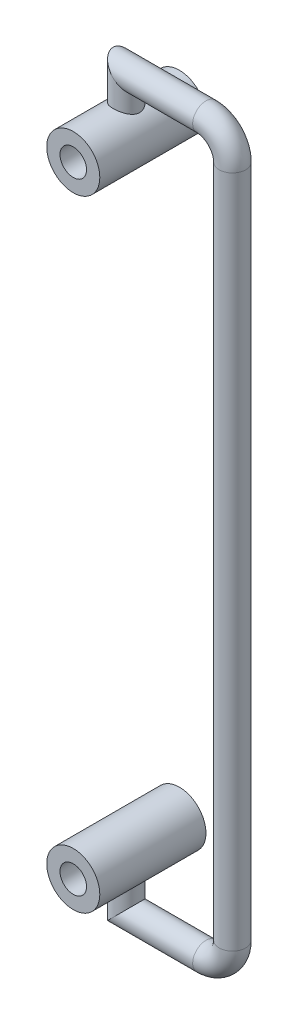
ISO-10303-21;
HEADER;
FILE_DESCRIPTION(('STEP AP214'),'2;1');
FILE_NAME('part.step','',(''),(''),'','','');
FILE_SCHEMA(('AUTOMOTIVE_DESIGN { 1 0 10303 214 1 1 1 1 }'));
ENDSEC;
DATA;
#1=APPLICATION_CONTEXT('core data for automotive mechanical design processes');
#2=APPLICATION_PROTOCOL_DEFINITION('international standard','automotive_design',2000,#1);
#3=PRODUCT_CONTEXT('',#1,'mechanical');
#4=PRODUCT('Part','Part','',(#3));
#5=PRODUCT_RELATED_PRODUCT_CATEGORY('part','',(#4));
#6=PRODUCT_DEFINITION_FORMATION('','',#4);
#7=PRODUCT_DEFINITION_CONTEXT('part definition',#1,'design');
#8=PRODUCT_DEFINITION('design','',#6,#7);
#9=PRODUCT_DEFINITION_SHAPE('','',#8);
#10=(LENGTH_UNIT() NAMED_UNIT(*) SI_UNIT(.MILLI.,.METRE.));
#11=(NAMED_UNIT(*) PLANE_ANGLE_UNIT() SI_UNIT($,.RADIAN.));
#12=(NAMED_UNIT(*) SI_UNIT($,.STERADIAN.) SOLID_ANGLE_UNIT());
#13=UNCERTAINTY_MEASURE_WITH_UNIT(LENGTH_MEASURE(1.E-05),#10,'distance_accuracy_value','');
#14=(GEOMETRIC_REPRESENTATION_CONTEXT(3) GLOBAL_UNCERTAINTY_ASSIGNED_CONTEXT((#13)) GLOBAL_UNIT_ASSIGNED_CONTEXT((#10,
#11,#12)) REPRESENTATION_CONTEXT('',''));
#15=CARTESIAN_POINT('',(0.,0.,0.));
#16=DIRECTION('',(0.,0.,1.));
#17=DIRECTION('',(1.,0.,0.));
#18=AXIS2_PLACEMENT_3D('',#15,#16,#17);
#19=CARTESIAN_POINT('',(0.,0.,0.));
#20=DIRECTION('',(0.,1.,0.));
#21=DIRECTION('',(0.,0.,1.));
#22=AXIS2_PLACEMENT_3D('',#19,#20,#21);
#23=CYLINDRICAL_SURFACE('',#22,2.5);
#24=CARTESIAN_POINT('',(0.,5.,2.5));
#25=CARTESIAN_POINT('',(0.131426682334303,5.00000822449528,2.49999033094399));
#26=CARTESIAN_POINT('',(0.263015634437211,5.00523800864723,2.48957443822597));
#27=CARTESIAN_POINT('',(0.522301454622881,5.0256458143898,2.44836817883795));
#28=CARTESIAN_POINT('',(0.649990448564103,5.0408427281233,2.41753911907498));
#29=CARTESIAN_POINT('',(0.897333631316201,5.07959309077523,2.33701537728116));
#30=CARTESIAN_POINT('',(1.01701694536277,5.10311404092741,2.28739401221727));
#31=CARTESIAN_POINT('',(1.24618160399671,5.15635556674173,2.1710734737482));
#32=CARTESIAN_POINT('',(1.3556637520377,5.18607565355579,2.10437564685491));
#33=CARTESIAN_POINT('',(1.56876952630998,5.25109354949368,1.95120686835737));
#34=CARTESIAN_POINT('',(1.67163802294308,5.28662002340909,1.86378379977022));
#35=CARTESIAN_POINT('',(1.86194861703332,5.35850074223269,1.67369630401471));
#36=CARTESIAN_POINT('',(1.94937895911555,5.39485559433103,1.57102037115989));
#37=CARTESIAN_POINT('',(2.11312999967247,5.46752622054378,1.34379162555472));
#38=CARTESIAN_POINT('',(2.18806333849064,5.50362032587433,1.21815975396499));
#39=CARTESIAN_POINT('',(2.31542056761491,5.56785053056445,0.954081660204566));
#40=CARTESIAN_POINT('',(2.36786053751682,5.59599230979208,0.815644678237382));
#41=CARTESIAN_POINT('',(2.44533110537652,5.63855332408598,0.538337236403588));
#42=CARTESIAN_POINT('',(2.47181464267578,5.65369321041548,0.399988869820419));
#43=CARTESIAN_POINT('',(2.50106748329741,5.6704527512785,0.120052905562393));
#44=CARTESIAN_POINT('',(2.50386022093906,5.6720857664157,-0.0215313521750929));
#45=CARTESIAN_POINT('',(2.48671821792512,5.66222674357063,-0.285715060790881));
#46=CARTESIAN_POINT('',(2.46946139884055,5.65228090845015,-0.408560078058286));
#47=CARTESIAN_POINT('',(2.41734962264383,5.62309428165325,-0.649304773431946));
#48=CARTESIAN_POINT('',(2.38248905974454,5.60385052920546,-0.767202863263111));
#49=CARTESIAN_POINT('',(2.29552445096459,5.55781308968161,-0.998072831414331));
#50=CARTESIAN_POINT('',(2.24303766778987,5.53085398340007,-1.11086599696452));
#51=CARTESIAN_POINT('',(2.12260421917012,5.47241489296487,-1.32658573147497));
#52=CARTESIAN_POINT('',(2.0546506095312,5.44093288049522,-1.42950783900021));
#53=CARTESIAN_POINT('',(1.89516513728193,5.37217105241787,-1.63630313185808));
#54=CARTESIAN_POINT('',(1.80173614592319,5.33466224408135,-1.7386421839404));
#55=CARTESIAN_POINT('',(1.59888894685344,5.26130941748981,-1.92683854647725));
#56=CARTESIAN_POINT('',(1.48946314143571,5.22546620102997,-2.0126879800847));
#57=CARTESIAN_POINT('',(1.25129126457962,5.15745031792591,-2.16921415257432));
#58=CARTESIAN_POINT('',(1.12188397899853,5.12552539594985,-2.23900118111436));
#59=CARTESIAN_POINT('',(0.851165538721983,5.07105297196891,-2.35524257260752));
#60=CARTESIAN_POINT('',(0.70986394066316,5.04849802641107,-2.4017154625379));
#61=CARTESIAN_POINT('',(0.431916229151778,5.01689165646421,-2.4661885092917));
#62=CARTESIAN_POINT('',(0.295853826370904,5.0068765424676,-2.486228089367));
#63=CARTESIAN_POINT('',(0.0219489998732863,4.99817466352206,-2.50366182783617));
#64=CARTESIAN_POINT('',(-0.115892549675111,4.99948253196574,-2.5010667140985));
#65=CARTESIAN_POINT('',(-0.378082429964658,5.01272019366532,-2.4744832789533));
#66=CARTESIAN_POINT('',(-0.502648520123707,5.02381885780008,-2.45216866817559));
#67=CARTESIAN_POINT('',(-0.746017230755973,5.05444571712471,-2.38940482026161));
#68=CARTESIAN_POINT('',(-0.864819214231885,5.07397484162375,-2.3489535838641));
#69=CARTESIAN_POINT('',(-1.09722152111965,5.12039371467671,-2.25000383391964));
#70=CARTESIAN_POINT('',(-1.21057599249831,5.14747795582127,-2.19102237471768));
#71=CARTESIAN_POINT('',(-1.42615340426439,5.2064006420025,-2.05723116087518));
#72=CARTESIAN_POINT('',(-1.52837157450204,5.23824111059466,-1.98241466348012));
#73=CARTESIAN_POINT('',(-1.72941922315487,5.30729446684913,-1.81059893670911));
#74=CARTESIAN_POINT('',(-1.82693019428496,5.34472787990512,-1.7121428290248));
#75=CARTESIAN_POINT('',(-2.0046408025722,5.41844021078413,-1.50018712195056));
#76=CARTESIAN_POINT('',(-2.08482846428685,5.45471831527593,-1.38667720293013));
#77=CARTESIAN_POINT('',(-2.22926978618995,5.5237201945472,-1.14089086451535));
#78=CARTESIAN_POINT('',(-2.29256373922243,5.55618676018746,-1.00797183470886));
#79=CARTESIAN_POINT('',(-2.39520706511459,5.61064819273254,-0.731224831117447));
#80=CARTESIAN_POINT('',(-2.43458729077056,5.63265654450986,-0.587411184000008));
#81=CARTESIAN_POINT('',(-2.48465421767005,5.66096247430649,-0.307724442637056));
#82=CARTESIAN_POINT('',(-2.4977324874436,5.66856541325904,-0.17241436588103));
#83=CARTESIAN_POINT('',(-2.50172288950898,5.67086613407421,0.0986176673806802));
#84=CARTESIAN_POINT('',(-2.49264462983266,5.66556950974889,0.23433941987363));
#85=CARTESIAN_POINT('',(-2.45481530197332,5.64405344835337,0.48870875561685));
#86=CARTESIAN_POINT('',(-2.42802074302696,5.62892263661867,0.607751181720765));
#87=CARTESIAN_POINT('',(-2.35793843840544,5.59072459662397,0.839520292199955));
#88=CARTESIAN_POINT('',(-2.31464538728732,5.56765481565035,0.952244931566542));
#89=CARTESIAN_POINT('',(-2.20953919315538,5.51428673566587,1.17656215271973));
#90=CARTESIAN_POINT('',(-2.14667719009403,5.4836069200155,1.28756985173502));
#91=CARTESIAN_POINT('',(-2.0053780838799,5.41911672922545,1.49818624324005));
#92=CARTESIAN_POINT('',(-1.92693287765888,5.38530473029233,1.59778896262873));
#93=CARTESIAN_POINT('',(-1.74550556946065,5.31344183672989,1.79535536374964));
#94=CARTESIAN_POINT('',(-1.6407002246921,5.27537508485019,1.89164936417138));
#95=CARTESIAN_POINT('',(-1.41539785420684,5.20305652616455,2.06565584942804));
#96=CARTESIAN_POINT('',(-1.29489242426332,5.16880678094554,2.14335831860588));
#97=CARTESIAN_POINT('',(-1.03978808878536,5.10754850542218,2.2780969794841));
#98=CARTESIAN_POINT('',(-0.905095560782287,5.08059288562512,2.33498316778445));
#99=CARTESIAN_POINT('',(-0.696328709257351,5.04822039076649,2.4021838587924));
#100=CARTESIAN_POINT('',(-0.625670413494088,5.03877685918126,2.42155539800181));
#101=CARTESIAN_POINT('',(-0.482623997839258,5.02282872724899,2.4540659483706));
#102=CARTESIAN_POINT('',(-0.410236963092401,5.01632233176841,2.46720876667635));
#103=CARTESIAN_POINT('',(-0.281518684621671,5.0076179923387,2.48473747228463));
#104=CARTESIAN_POINT('',(-0.225408499555445,5.00476711533546,2.49045493653132));
#105=CARTESIAN_POINT('',(-0.11287552845629,5.00095632670341,2.49808832946571));
#106=CARTESIAN_POINT('',(-0.0564527338382193,4.99999646726802,2.50000415322548));
#107=CARTESIAN_POINT('',(0.,5.,2.5));
#108=B_SPLINE_CURVE_WITH_KNOTS('',3,(#24,#25,#26,#27,#28,#29,#30,#31,#32,#33,#34,#35,#36,#37,
#38,#39,#40,#41,#42,#43,#44,#45,#46,#47,#48,#49,#50,#51,#52,#53,#54,#55,#56,#57,#58,#59,#60,#61,
#62,#63,#64,#65,#66,#67,#68,#69,#70,#71,#72,#73,#74,#75,#76,#77,#78,#79,#80,#81,#82,#83,#84,#85,
#86,#87,#88,#89,#90,#91,#92,#93,#94,#95,#96,#97,#98,#99,#100,#101,#102,#103,#104,#105,#106,
#107),.UNSPECIFIED.,.T.,.F.,(4,2,2,2,2,2,2,2,2,2,2,2,2,2,2,2,2,2,2,2,2,2,2,2,2,2,2,2,2,2,2,2,2,
2,2,2,2,2,2,2,2,4),(0.,0.394060643550731,0.788870374272994,1.18215538873075,1.57540940145392,
1.99245439679522,2.40981559413509,2.85954316076882,3.30894869745702,3.73145030350574,
4.15353393322551,4.52514281023301,4.89687009814196,5.27725600421218,5.65781303150554,
6.08662353334696,6.51563836496716,6.96457555536101,7.41315542280699,7.82458226178364,
8.2358141127869,8.61517266265304,8.99457304077328,9.38482140069746,9.77523626870848,
10.2039902661037,10.6330397153795,11.0828670540368,11.53211279863,11.9382326875699,
12.3441764966106,12.7114482562151,13.0788382197025,13.4709114195009,13.8631890285845,
14.303131068923,14.7433095845248,15.1866003415819,15.407934939208,15.6291340766843,
15.7983933645035,15.9676573239322),.UNSPECIFIED.);
#109=CARTESIAN_POINT('',(0.,5.,2.5));
#110=VERTEX_POINT('',#109);
#111=EDGE_CURVE('E11',#110,#110,#108,.T.);
#112=ORIENTED_EDGE('',*,*,#111,.F.);
#113=EDGE_LOOP('',(#112));
#114=FACE_BOUND('',#113,.T.);
#115=CARTESIAN_POINT('',(0.,0.,0.));
#116=DIRECTION('',(-0.707106781186548,0.707106781186548,0.));
#117=DIRECTION('',(-0.707106781186548,-0.707106781186548,0.));
#118=AXIS2_PLACEMENT_3D('',#115,#116,#117);
#119=ELLIPSE('',#118,3.53553390593274,2.5);
#120=CARTESIAN_POINT('',(-2.5,-2.5,0.));
#121=VERTEX_POINT('',#120);
#122=EDGE_CURVE('E44',#121,#121,#119,.T.);
#123=ORIENTED_EDGE('',*,*,#122,.T.);
#124=EDGE_LOOP('',(#123));
#125=FACE_BOUND('',#124,.T.);
#126=ADVANCED_FACE('F34',(#114,#125),#23,.T.);
#127=CARTESIAN_POINT('',(15.,0.,0.));
#128=DIRECTION('',(-1.,0.,0.));
#129=DIRECTION('',(0.,-1.,0.));
#130=AXIS2_PLACEMENT_3D('',#127,#128,#129);
#131=CYLINDRICAL_SURFACE('',#130,2.5);
#132=CARTESIAN_POINT('',(15.,0.,0.));
#133=DIRECTION('',(-1.,0.,0.));
#134=DIRECTION('',(0.,-1.,0.));
#135=AXIS2_PLACEMENT_3D('',#132,#133,#134);
#136=CIRCLE('',#135,2.5);
#137=CARTESIAN_POINT('',(15.,-2.5,0.));
#138=VERTEX_POINT('',#137);
#139=EDGE_CURVE('E48',#138,#138,#136,.F.);
#140=ORIENTED_EDGE('',*,*,#139,.F.);
#141=EDGE_LOOP('',(#140));
#142=FACE_BOUND('',#141,.T.);
#143=ORIENTED_EDGE('',*,*,#122,.F.);
#144=EDGE_LOOP('',(#143));
#145=FACE_BOUND('',#144,.T.);
#146=ADVANCED_FACE('F103',(#142,#145),#131,.T.);
#147=CARTESIAN_POINT('',(15.,5.,0.));
#148=DIRECTION('',(0.,0.,-1.));
#149=DIRECTION('',(-1.,0.,0.));
#150=AXIS2_PLACEMENT_3D('',#147,#148,#149);
#151=TOROIDAL_SURFACE('',#150,5.,2.5);
#152=CARTESIAN_POINT('',(20.,5.00000000000006,0.));
#153=DIRECTION('',(0.,-1.,0.));
#154=DIRECTION('',(1.,0.,0.));
#155=AXIS2_PLACEMENT_3D('',#152,#153,#154);
#156=CIRCLE('',#155,2.5);
#157=CARTESIAN_POINT('',(22.5,5.00000000000009,0.));
#158=VERTEX_POINT('',#157);
#159=EDGE_CURVE('E53',#158,#158,#156,.F.);
#160=CARTESIAN_POINT('',(15.,5.,0.));
#161=DIRECTION('',(0.,0.,-1.));
#162=DIRECTION('',(-1.,0.,0.));
#163=AXIS2_PLACEMENT_3D('',#160,#161,#162);
#164=CIRCLE('',#163,7.5);
#165=EDGE_CURVE('',#158,#138,#164,.T.);
#166=ORIENTED_EDGE('',*,*,#159,.F.);
#167=ORIENTED_EDGE('',*,*,#139,.T.);
#168=ORIENTED_EDGE('',*,*,#165,.T.);
#169=ORIENTED_EDGE('',*,*,#165,.F.);
#170=EDGE_LOOP('',(#166,#168,#167,#169));
#171=FACE_BOUND('',#170,.T.);
#172=ADVANCED_FACE('F108',(#171),#151,.T.);
#173=CARTESIAN_POINT('',(20.,132.,0.));
#174=DIRECTION('',(0.,-1.,0.));
#175=DIRECTION('',(1.,0.,0.));
#176=AXIS2_PLACEMENT_3D('',#173,#174,#175);
#177=CYLINDRICAL_SURFACE('',#176,2.5);
#178=CARTESIAN_POINT('',(20.,132.,0.));
#179=DIRECTION('',(0.,-1.,0.));
#180=DIRECTION('',(1.,0.,0.));
#181=AXIS2_PLACEMENT_3D('',#178,#179,#180);
#182=CIRCLE('',#181,2.5);
#183=CARTESIAN_POINT('',(22.5,132.,0.));
#184=VERTEX_POINT('',#183);
#185=EDGE_CURVE('E138',#184,#184,#182,.F.);
#186=CARTESIAN_POINT('',(22.5,132.,0.));
#187=CARTESIAN_POINT('',(22.5,130.677083333333,0.));
#188=CARTESIAN_POINT('',(22.5,129.354166666667,0.));
#189=CARTESIAN_POINT('',(22.5,126.708333333333,0.));
#190=CARTESIAN_POINT('',(22.5,125.385416666667,0.));
#191=CARTESIAN_POINT('',(22.5,122.739583333333,0.));
#192=CARTESIAN_POINT('',(22.5,121.416666666667,0.));
#193=CARTESIAN_POINT('',(22.5,118.770833333333,0.));
#194=CARTESIAN_POINT('',(22.5,117.447916666667,0.));
#195=CARTESIAN_POINT('',(22.5,114.802083333333,0.));
#196=CARTESIAN_POINT('',(22.5,113.479166666667,0.));
#197=CARTESIAN_POINT('',(22.5,110.833333333333,0.));
#198=CARTESIAN_POINT('',(22.5,109.510416666667,0.));
#199=CARTESIAN_POINT('',(22.5,106.864583333333,0.));
#200=CARTESIAN_POINT('',(22.5,105.541666666667,0.));
#201=CARTESIAN_POINT('',(22.5,102.895833333333,0.));
#202=CARTESIAN_POINT('',(22.5,101.572916666667,0.));
#203=CARTESIAN_POINT('',(22.5,98.9270833333333,0.));
#204=CARTESIAN_POINT('',(22.5,97.6041666666667,0.));
#205=CARTESIAN_POINT('',(22.5,94.9583333333333,0.));
#206=CARTESIAN_POINT('',(22.5,93.6354166666667,0.));
#207=CARTESIAN_POINT('',(22.5,90.9895833333333,0.));
#208=CARTESIAN_POINT('',(22.5,89.6666666666667,0.));
#209=CARTESIAN_POINT('',(22.5,87.0208333333333,0.));
#210=CARTESIAN_POINT('',(22.5,85.6979166666667,0.));
#211=CARTESIAN_POINT('',(22.5,83.0520833333333,0.));
#212=CARTESIAN_POINT('',(22.5,81.7291666666667,0.));
#213=CARTESIAN_POINT('',(22.5,79.0833333333333,0.));
#214=CARTESIAN_POINT('',(22.5,77.7604166666667,0.));
#215=CARTESIAN_POINT('',(22.5,75.1145833333333,0.));
#216=CARTESIAN_POINT('',(22.5,73.7916666666667,0.));
#217=CARTESIAN_POINT('',(22.5,71.1458333333333,0.));
#218=CARTESIAN_POINT('',(22.5,69.8229166666667,0.));
#219=CARTESIAN_POINT('',(22.5,67.1770833333333,0.));
#220=CARTESIAN_POINT('',(22.5,65.8541666666667,0.));
#221=CARTESIAN_POINT('',(22.5,63.2083333333333,0.));
#222=CARTESIAN_POINT('',(22.5,61.8854166666667,0.));
#223=CARTESIAN_POINT('',(22.5,59.2395833333333,0.));
#224=CARTESIAN_POINT('',(22.5,57.9166666666667,0.));
#225=CARTESIAN_POINT('',(22.5,55.2708333333333,0.));
#226=CARTESIAN_POINT('',(22.5,53.9479166666667,0.));
#227=CARTESIAN_POINT('',(22.5,51.3020833333333,0.));
#228=CARTESIAN_POINT('',(22.5,49.9791666666667,0.));
#229=CARTESIAN_POINT('',(22.5,47.3333333333333,0.));
#230=CARTESIAN_POINT('',(22.5,46.0104166666667,0.));
#231=CARTESIAN_POINT('',(22.5,43.3645833333333,0.));
#232=CARTESIAN_POINT('',(22.5,42.0416666666667,0.));
#233=CARTESIAN_POINT('',(22.5,39.3958333333333,0.));
#234=CARTESIAN_POINT('',(22.5,38.0729166666667,0.));
#235=CARTESIAN_POINT('',(22.5,35.4270833333333,0.));
#236=CARTESIAN_POINT('',(22.5,34.1041666666667,0.));
#237=CARTESIAN_POINT('',(22.5,31.4583333333333,0.));
#238=CARTESIAN_POINT('',(22.5,30.1354166666667,0.));
#239=CARTESIAN_POINT('',(22.5,27.4895833333333,0.));
#240=CARTESIAN_POINT('',(22.5,26.1666666666667,0.));
#241=CARTESIAN_POINT('',(22.5,23.5208333333333,0.));
#242=CARTESIAN_POINT('',(22.5,22.1979166666667,0.));
#243=CARTESIAN_POINT('',(22.5,19.5520833333333,0.));
#244=CARTESIAN_POINT('',(22.5,18.2291666666667,0.));
#245=CARTESIAN_POINT('',(22.5,15.5833333333333,0.));
#246=CARTESIAN_POINT('',(22.5,14.2604166666667,0.));
#247=CARTESIAN_POINT('',(22.5,11.6145833333333,0.));
#248=CARTESIAN_POINT('',(22.5,10.2916666666667,0.));
#249=CARTESIAN_POINT('',(22.5,7.64583333333334,0.));
#250=CARTESIAN_POINT('',(22.5,6.32291666666669,0.));
#251=CARTESIAN_POINT('',(22.5,5.00000000000003,0.));
#252=B_SPLINE_CURVE_WITH_KNOTS('',3,(#186,#187,#188,#189,#190,#191,#192,#193,#194,#195,#196,
#197,#198,#199,#200,#201,#202,#203,#204,#205,#206,#207,#208,#209,#210,#211,#212,#213,#214,#215,
#216,#217,#218,#219,#220,#221,#222,#223,#224,#225,#226,#227,#228,#229,#230,#231,#232,#233,#234,
#235,#236,#237,#238,#239,#240,#241,#242,#243,#244,#245,#246,#247,#248,#249,#250,#251),
.UNSPECIFIED.,.F.,.F.,(4,2,2,2,2,2,2,2,2,2,2,2,2,2,2,2,2,2,2,2,2,2,2,2,2,2,2,2,2,2,2,2,4),(0.,
3.96875000000002,7.93750000000001,11.90625,15.875,19.84375,23.8125,27.78125,31.75,35.71875,
39.6875,43.65625,47.625,51.59375,55.5625,59.53125,63.5,67.46875,71.4375,75.40625,79.375,
83.34375,87.3125,91.28125,95.25,99.21875,103.1875,107.15625,111.125,115.09375,119.0625,
123.03125,127.),.UNSPECIFIED.);
#253=EDGE_CURVE('BSEAM113',#184,#158,#252,.T.);
#254=ORIENTED_EDGE('',*,*,#185,.F.);
#255=ORIENTED_EDGE('',*,*,#159,.T.);
#256=ORIENTED_EDGE('',*,*,#253,.T.);
#257=ORIENTED_EDGE('',*,*,#253,.F.);
#258=EDGE_LOOP('',(#254,#256,#255,#257));
#259=FACE_BOUND('',#258,.T.);
#260=ADVANCED_FACE('F113',(#259),#177,.T.);
#261=CARTESIAN_POINT('',(15.,132.,0.));
#262=DIRECTION('',(0.,0.,-1.));
#263=DIRECTION('',(-1.,0.,0.));
#264=AXIS2_PLACEMENT_3D('',#261,#262,#263);
#265=TOROIDAL_SURFACE('',#264,5.,2.5);
#266=CARTESIAN_POINT('',(15.,137.,0.));
#267=DIRECTION('',(1.,0.,0.));
#268=DIRECTION('',(0.,1.,0.));
#269=AXIS2_PLACEMENT_3D('',#266,#267,#268);
#270=CIRCLE('',#269,2.5);
#271=CARTESIAN_POINT('',(14.9999999999999,139.5,0.));
#272=VERTEX_POINT('',#271);
#273=EDGE_CURVE('E137',#272,#272,#270,.F.);
#274=CARTESIAN_POINT('',(15.,132.,0.));
#275=DIRECTION('',(0.,0.,-1.));
#276=DIRECTION('',(-1.,0.,0.));
#277=AXIS2_PLACEMENT_3D('',#274,#275,#276);
#278=CIRCLE('',#277,7.5);
#279=EDGE_CURVE('',#272,#184,#278,.T.);
#280=ORIENTED_EDGE('',*,*,#273,.F.);
#281=ORIENTED_EDGE('',*,*,#185,.T.);
#282=ORIENTED_EDGE('',*,*,#279,.T.);
#283=ORIENTED_EDGE('',*,*,#279,.F.);
#284=EDGE_LOOP('',(#280,#282,#281,#283));
#285=FACE_BOUND('',#284,.T.);
#286=ADVANCED_FACE('F121',(#285),#265,.T.);
#287=CARTESIAN_POINT('',(0.,137.,0.));
#288=DIRECTION('',(1.,0.,0.));
#289=DIRECTION('',(0.,0.,-1.));
#290=AXIS2_PLACEMENT_3D('',#287,#288,#289);
#291=CYLINDRICAL_SURFACE('',#290,2.5);
#292=CARTESIAN_POINT('',(0.,137.,0.));
#293=DIRECTION('',(0.707106781186547,0.707106781186548,0.));
#294=DIRECTION('',(0.707106781186548,-0.707106781186547,0.));
#295=AXIS2_PLACEMENT_3D('',#292,#293,#294);
#296=ELLIPSE('',#295,3.53553390593274,2.5);
#297=CARTESIAN_POINT('',(2.5,134.5,0.));
#298=VERTEX_POINT('',#297);
#299=EDGE_CURVE('E62',#298,#298,#296,.T.);
#300=ORIENTED_EDGE('',*,*,#299,.T.);
#301=EDGE_LOOP('',(#300));
#302=FACE_BOUND('',#301,.T.);
#303=ORIENTED_EDGE('',*,*,#273,.T.);
#304=EDGE_LOOP('',(#303));
#305=FACE_BOUND('',#304,.T.);
#306=ADVANCED_FACE('F124',(#302,#305),#291,.T.);
#307=CARTESIAN_POINT('',(0.,144.071067811865,0.));
#308=DIRECTION('',(0.,-1.,0.));
#309=DIRECTION('',(1.,0.,0.));
#310=AXIS2_PLACEMENT_3D('',#307,#308,#309);
#311=CYLINDRICAL_SURFACE('',#310,2.5);
#312=CARTESIAN_POINT('',(2.5,131.330127018922,0.));
#313=CARTESIAN_POINT('',(2.49998948436432,131.33013982273,-0.130266506876492));
#314=CARTESIAN_POINT('',(2.48974954513168,131.336095419656,-0.260702720676249));
#315=CARTESIAN_POINT('',(2.44930840724944,131.359058770519,-0.517568971529231));
#316=CARTESIAN_POINT('',(2.41906526369545,131.37608974726,-0.643990004057287));
#317=CARTESIAN_POINT('',(2.3402497699757,131.418733768717,-0.888628945561065));
#318=CARTESIAN_POINT('',(2.29177485369963,131.444301113389,-1.00688657356221));
#319=CARTESIAN_POINT('',(2.17816884056414,131.501066591115,-1.23356056309455));
#320=CARTESIAN_POINT('',(2.11303684262671,131.532265028759,-1.34197639179579));
#321=CARTESIAN_POINT('',(1.96166634317253,131.599921735249,-1.55576430391692));
#322=CARTESIAN_POINT('',(1.87413008816917,131.636601593316,-1.66014783448976));
#323=CARTESIAN_POINT('',(1.68313452122752,131.709299567275,-1.8535209757132));
#324=CARTESIAN_POINT('',(1.57966731506052,131.745317345128,-1.94250290775495));
#325=CARTESIAN_POINT('',(1.35122390789082,131.815536924521,-2.10841787648563));
#326=CARTESIAN_POINT('',(1.22526797235895,131.849452660641,-2.18413441927913));
#327=CARTESIAN_POINT('',(0.960392566671156,131.908768902302,-2.31285213348385));
#328=CARTESIAN_POINT('',(0.821481345389991,131.934174779545,-2.36586764043849));
#329=CARTESIAN_POINT('',(0.545112359773531,131.972011531151,-2.44376165316397));
#330=CARTESIAN_POINT('',(0.408254476210991,131.985237005534,-2.47037381586512));
#331=CARTESIAN_POINT('',(0.131426571755683,132.00018959614,-2.50041529671129));
#332=CARTESIAN_POINT('',(-0.00854151460650431,132.001923669612,-2.50385864199536));
#333=CARTESIAN_POINT('',(-0.274581311061964,131.994074547914,-2.48813331506857));
#334=CARTESIAN_POINT('',(-0.400802997942673,131.985462397305,-2.47090496119545));
#335=CARTESIAN_POINT('',(-0.648284429795111,131.959356131493,-2.41779789023985));
#336=CARTESIAN_POINT('',(-0.769543802734626,131.94186135166,-2.38191777755984));
#337=CARTESIAN_POINT('',(-1.00577347892407,131.899289582192,-2.29229358477506));
#338=CARTESIAN_POINT('',(-1.120633558788,131.87411103823,-2.23830921706972));
#339=CARTESIAN_POINT('',(-1.33994200378327,131.818441149667,-2.11434145949637));
#340=CARTESIAN_POINT('',(-1.4443866220966,131.787947903937,-2.04435234174415));
#341=CARTESIAN_POINT('',(-1.65043415224551,131.721109859981,-1.88276162116742));
#342=CARTESIAN_POINT('',(-1.75083518757341,131.684484399954,-1.78974242918496));
#343=CARTESIAN_POINT('',(-1.93526092574445,131.61135851467,-1.58852568767456));
#344=CARTESIAN_POINT('',(-2.01927302893558,131.574858206641,-1.48031656931484));
#345=CARTESIAN_POINT('',(-2.17376333660553,131.503603902312,-1.24337951893978));
#346=CARTESIAN_POINT('',(-2.24304328744513,131.469107999768,-1.11378494236447));
#347=CARTESIAN_POINT('',(-2.35829778250308,131.409386256964,-0.842655821602504));
#348=CARTESIAN_POINT('',(-2.40429664552722,131.384150751152,-0.701133917456094));
#349=CARTESIAN_POINT('',(-2.4679505275626,131.348615895426,-0.421963721793027));
#350=CARTESIAN_POINT('',(-2.48756280529994,131.337291396212,-0.284897202391129));
#351=CARTESIAN_POINT('',(-2.50379236652857,131.32794798404,-0.00899664620863778));
#352=CARTESIAN_POINT('',(-2.50042589328757,131.329919672233,0.129836072799497));
#353=CARTESIAN_POINT('',(-2.47259010835991,131.345858413515,0.389134796446797));
#354=CARTESIAN_POINT('',(-2.45046954178115,131.358489687666,0.50994862776973));
#355=CARTESIAN_POINT('',(-2.38924071158111,131.392350538784,0.745919465677486));
#356=CARTESIAN_POINT('',(-2.35012694655908,131.413582900126,0.861074626866854));
#357=CARTESIAN_POINT('',(-2.25411897151217,131.463405551991,1.0885283272564));
#358=CARTESIAN_POINT('',(-2.19648515923162,131.492291081077,1.20044754213256));
#359=CARTESIAN_POINT('',(-2.06571766003969,131.553902987431,1.4136731788488));
#360=CARTESIAN_POINT('',(-1.99257601083123,131.586631333879,1.51497410878814));
#361=CARTESIAN_POINT('',(-1.82209291799635,131.657199961408,1.71744691880333));
#362=CARTESIAN_POINT('',(-1.72286318078434,131.695164578857,1.81699287677223));
#363=CARTESIAN_POINT('',(-1.50851123849879,131.768355874447,1.99853059500592));
#364=CARTESIAN_POINT('',(-1.39338368664988,131.803581625193,2.08051642565855));
#365=CARTESIAN_POINT('',(-1.14633840638507,131.868534042273,2.22643431479089));
#366=CARTESIAN_POINT('',(-1.01405774389061,131.898091041799,2.28983279520846));
#367=CARTESIAN_POINT('',(-0.738805911647325,131.947083873985,2.39284475996202));
#368=CARTESIAN_POINT('',(-0.595844253647063,131.966528591917,2.43247912960512));
#369=CARTESIAN_POINT('',(-0.317449205674704,131.99168770454,2.48342140935642));
#370=CARTESIAN_POINT('',(-0.182528609085375,131.998498197678,2.49699468583034));
#371=CARTESIAN_POINT('',(0.0878149643374331,132.001053259405,2.50210816749459));
#372=CARTESIAN_POINT('',(0.223237748727019,131.99680170177,2.49365608566108));
#373=CARTESIAN_POINT('',(0.481344982671076,131.978349220856,2.45645896960449));
#374=CARTESIAN_POINT('',(0.604280801321775,131.964822366368,2.42908782836368));
#375=CARTESIAN_POINT('',(0.843614873664457,131.929802341917,2.35668255024167));
#376=CARTESIAN_POINT('',(0.960012187087216,131.908308029555,2.31164588036637));
#377=CARTESIAN_POINT('',(1.18855854199593,131.858148267415,2.20318218126074));
#378=CARTESIAN_POINT('',(1.30031295715363,131.829215425068,2.13905097531015));
#379=CARTESIAN_POINT('',(1.51193650408535,131.76720333345,1.99510588985241));
#380=CARTESIAN_POINT('',(1.61180014305397,131.734122182291,1.91528480737313));
#381=CARTESIAN_POINT('',(1.8072854232437,131.663215235509,1.73300420555063));
#382=CARTESIAN_POINT('',(1.90149582349003,131.625244896584,1.62908227399926));
#383=CARTESIAN_POINT('',(2.07165660492504,131.551576982849,1.40638471461776));
#384=CARTESIAN_POINT('',(2.14759083151541,131.515881439106,1.28759608580076));
#385=CARTESIAN_POINT('',(2.28108393396029,131.449989828239,1.03336388233573));
#386=CARTESIAN_POINT('',(2.3379862797745,131.42000320347,0.897512611575388));
#387=CARTESIAN_POINT('',(2.40494911880459,131.383702726601,0.686777350480221));
#388=CARTESIAN_POINT('',(2.42419582683991,131.373054866461,0.615440224302387));
#389=CARTESIAN_POINT('',(2.45635087255789,131.355075741709,0.470959303150666));
#390=CARTESIAN_POINT('',(2.46926364179176,131.347742158542,0.397816809045585));
#391=CARTESIAN_POINT('',(2.48591166201423,131.338237795429,0.270499013453062));
#392=CARTESIAN_POINT('',(2.49118864979202,131.335204870248,0.216583678487794));
#393=CARTESIAN_POINT('',(2.49823512543933,131.331146749113,0.108455383689593));
#394=CARTESIAN_POINT('',(2.50000437866474,131.330121687473,0.0542424041894477));
#395=CARTESIAN_POINT('',(2.5,131.330127018922,0.));
#396=B_SPLINE_CURVE_WITH_KNOTS('',3,(#312,#313,#314,#315,#316,#317,#318,#319,#320,#321,#322,
#323,#324,#325,#326,#327,#328,#329,#330,#331,#332,#333,#334,#335,#336,#337,#338,#339,#340,#341,
#342,#343,#344,#345,#346,#347,#348,#349,#350,#351,#352,#353,#354,#355,#356,#357,#358,#359,#360,
#361,#362,#363,#364,#365,#366,#367,#368,#369,#370,#371,#372,#373,#374,#375,#376,#377,#378,#379,
#380,#381,#382,#383,#384,#385,#386,#387,#388,#389,#390,#391,#392,#393,#394,#395),.UNSPECIFIED.,
.T.,.F.,(4,2,2,2,2,2,2,2,2,2,2,2,2,2,2,2,2,2,2,2,2,2,2,2,2,2,2,2,2,2,2,2,2,2,2,2,2,2,2,2,2,4),
(0.,0.390580306486789,0.781982232062012,1.17132148982692,1.56068181366371,1.98215578129641,
2.4038392771601,2.85394730601991,3.3037706741481,3.7215871242492,4.13915059220183,
4.52040243716429,4.90168281298721,5.2882383683295,5.67493248380763,6.09817978647311,
6.5217512061988,6.97222104328704,7.42221935534345,7.83655727140612,8.25060232976016,
8.61935458565147,8.9882263109524,9.37418241020301,9.76033715555202,10.1951685895662,
10.6301466245059,11.076604535375,11.5226694952701,11.927806759788,12.3328021699001,
12.7111106218381,13.0894733378512,13.4840187680376,13.8787457525688,14.3127560463025,
14.7471485711797,15.195268726016,15.4189244153949,15.6424233996907,15.8050484542806,
15.9676843870379),.UNSPECIFIED.);
#397=CARTESIAN_POINT('',(2.5,131.330127018922,0.));
#398=VERTEX_POINT('',#397);
#399=EDGE_CURVE('E56',#398,#398,#396,.T.);
#400=ORIENTED_EDGE('',*,*,#399,.T.);
#401=EDGE_LOOP('',(#400));
#402=FACE_BOUND('',#401,.T.);
#403=ORIENTED_EDGE('',*,*,#299,.F.);
#404=EDGE_LOOP('',(#403));
#405=FACE_BOUND('',#404,.T.);
#406=ADVANCED_FACE('F64',(#402,#405),#311,.T.);
#407=CARTESIAN_POINT('',(0.,127.,-10.));
#408=DIRECTION('',(0.,0.,1.));
#409=DIRECTION('',(1.,0.,0.));
#410=AXIS2_PLACEMENT_3D('',#407,#408,#409);
#411=CYLINDRICAL_SURFACE('',#410,5.);
#412=CARTESIAN_POINT('',(0.,127.,10.));
#413=DIRECTION('',(0.,0.,1.));
#414=DIRECTION('',(1.,0.,0.));
#415=AXIS2_PLACEMENT_3D('',#412,#413,#414);
#416=CIRCLE('',#415,5.);
#417=CARTESIAN_POINT('',(5.,127.,10.));
#418=VERTEX_POINT('',#417);
#419=EDGE_CURVE('E153',#418,#418,#416,.T.);
#420=ORIENTED_EDGE('',*,*,#419,.F.);
#421=EDGE_LOOP('',(#420));
#422=FACE_BOUND('',#421,.T.);
#423=CARTESIAN_POINT('',(0.,127.,-10.));
#424=DIRECTION('',(0.,0.,1.));
#425=DIRECTION('',(1.,0.,0.));
#426=AXIS2_PLACEMENT_3D('',#423,#424,#425);
#427=CIRCLE('',#426,5.);
#428=CARTESIAN_POINT('',(5.,127.,-10.));
#429=VERTEX_POINT('',#428);
#430=EDGE_CURVE('E63',#429,#429,#427,.T.);
#431=ORIENTED_EDGE('',*,*,#430,.T.);
#432=EDGE_LOOP('',(#431));
#433=FACE_BOUND('',#432,.T.);
#434=ORIENTED_EDGE('',*,*,#399,.F.);
#435=EDGE_LOOP('',(#434));
#436=FACE_BOUND('',#435,.T.);
#437=ADVANCED_FACE('F67',(#422,#433,#436),#411,.T.);
#438=CARTESIAN_POINT('',(0.,127.,-10.));
#439=DIRECTION('',(0.,0.,1.));
#440=DIRECTION('',(1.,0.,0.));
#441=AXIS2_PLACEMENT_3D('',#438,#439,#440);
#442=CYLINDRICAL_SURFACE('',#441,2.5);
#443=CARTESIAN_POINT('',(0.,127.,10.));
#444=DIRECTION('',(0.,0.,1.));
#445=DIRECTION('',(1.,0.,0.));
#446=AXIS2_PLACEMENT_3D('',#443,#444,#445);
#447=CIRCLE('',#446,2.5);
#448=CARTESIAN_POINT('',(2.5,127.,10.));
#449=VERTEX_POINT('',#448);
#450=EDGE_CURVE('E156',#449,#449,#447,.T.);
#451=ORIENTED_EDGE('',*,*,#450,.T.);
#452=EDGE_LOOP('',(#451));
#453=FACE_BOUND('',#452,.T.);
#454=CARTESIAN_POINT('',(0.,127.,-10.));
#455=DIRECTION('',(0.,0.,1.));
#456=DIRECTION('',(1.,0.,0.));
#457=AXIS2_PLACEMENT_3D('',#454,#455,#456);
#458=CIRCLE('',#457,2.5);
#459=CARTESIAN_POINT('',(2.5,127.,-10.));
#460=VERTEX_POINT('',#459);
#461=EDGE_CURVE('E150',#460,#460,#458,.T.);
#462=ORIENTED_EDGE('',*,*,#461,.F.);
#463=EDGE_LOOP('',(#462));
#464=FACE_BOUND('',#463,.T.);
#465=ADVANCED_FACE('F71',(#453,#464),#442,.F.);
#466=CARTESIAN_POINT('',(0.,127.,-10.));
#467=DIRECTION('',(0.,0.,1.));
#468=DIRECTION('',(1.,0.,0.));
#469=AXIS2_PLACEMENT_3D('',#466,#467,#468);
#470=PLANE('',#469);
#471=ORIENTED_EDGE('',*,*,#461,.T.);
#472=EDGE_LOOP('',(#471));
#473=FACE_BOUND('',#472,.T.);
#474=ORIENTED_EDGE('',*,*,#430,.F.);
#475=EDGE_LOOP('',(#474));
#476=FACE_BOUND('',#475,.T.);
#477=ADVANCED_FACE('F73',(#473,#476),#470,.F.);
#478=CARTESIAN_POINT('',(0.,127.,10.));
#479=DIRECTION('',(0.,0.,1.));
#480=DIRECTION('',(1.,0.,0.));
#481=AXIS2_PLACEMENT_3D('',#478,#479,#480);
#482=PLANE('',#481);
#483=ORIENTED_EDGE('',*,*,#419,.T.);
#484=EDGE_LOOP('',(#483));
#485=FACE_BOUND('',#484,.T.);
#486=ORIENTED_EDGE('',*,*,#450,.F.);
#487=EDGE_LOOP('',(#486));
#488=FACE_BOUND('',#487,.T.);
#489=ADVANCED_FACE('F76',(#485,#488),#482,.T.);
#490=CARTESIAN_POINT('',(0.,10.,-10.));
#491=DIRECTION('',(0.,0.,1.));
#492=DIRECTION('',(1.,0.,0.));
#493=AXIS2_PLACEMENT_3D('',#490,#491,#492);
#494=CYLINDRICAL_SURFACE('',#493,5.);
#495=ORIENTED_EDGE('',*,*,#111,.T.);
#496=EDGE_LOOP('',(#495));
#497=FACE_BOUND('',#496,.T.);
#498=CARTESIAN_POINT('',(0.,10.,-10.));
#499=DIRECTION('',(0.,0.,1.));
#500=DIRECTION('',(1.,0.,0.));
#501=AXIS2_PLACEMENT_3D('',#498,#499,#500);
#502=CIRCLE('',#501,5.);
#503=CARTESIAN_POINT('',(5.,10.,-10.));
#504=VERTEX_POINT('',#503);
#505=EDGE_CURVE('E159',#504,#504,#502,.T.);
#506=ORIENTED_EDGE('',*,*,#505,.T.);
#507=EDGE_LOOP('',(#506));
#508=FACE_BOUND('',#507,.T.);
#509=CARTESIAN_POINT('',(0.,10.,10.));
#510=DIRECTION('',(0.,0.,1.));
#511=DIRECTION('',(1.,0.,0.));
#512=AXIS2_PLACEMENT_3D('',#509,#510,#511);
#513=CIRCLE('',#512,5.);
#514=CARTESIAN_POINT('',(5.,10.,10.));
#515=VERTEX_POINT('',#514);
#516=EDGE_CURVE('E165',#515,#515,#513,.T.);
#517=ORIENTED_EDGE('',*,*,#516,.F.);
#518=EDGE_LOOP('',(#517));
#519=FACE_BOUND('',#518,.T.);
#520=ADVANCED_FACE('F82',(#497,#508,#519),#494,.T.);
#521=CARTESIAN_POINT('',(0.,10.,-10.));
#522=DIRECTION('',(0.,0.,1.));
#523=DIRECTION('',(1.,0.,0.));
#524=AXIS2_PLACEMENT_3D('',#521,#522,#523);
#525=PLANE('',#524);
#526=CARTESIAN_POINT('',(0.,10.,-10.));
#527=DIRECTION('',(0.,0.,1.));
#528=DIRECTION('',(1.,0.,0.));
#529=AXIS2_PLACEMENT_3D('',#526,#527,#528);
#530=CIRCLE('',#529,2.5);
#531=CARTESIAN_POINT('',(2.5,10.,-10.));
#532=VERTEX_POINT('',#531);
#533=EDGE_CURVE('E162',#532,#532,#530,.T.);
#534=ORIENTED_EDGE('',*,*,#533,.T.);
#535=EDGE_LOOP('',(#534));
#536=FACE_BOUND('',#535,.T.);
#537=ORIENTED_EDGE('',*,*,#505,.F.);
#538=EDGE_LOOP('',(#537));
#539=FACE_BOUND('',#538,.T.);
#540=ADVANCED_FACE('F87',(#536,#539),#525,.F.);
#541=CARTESIAN_POINT('',(0.,10.,-10.));
#542=DIRECTION('',(0.,0.,1.));
#543=DIRECTION('',(1.,0.,0.));
#544=AXIS2_PLACEMENT_3D('',#541,#542,#543);
#545=CYLINDRICAL_SURFACE('',#544,2.5);
#546=ORIENTED_EDGE('',*,*,#533,.F.);
#547=EDGE_LOOP('',(#546));
#548=FACE_BOUND('',#547,.T.);
#549=CARTESIAN_POINT('',(0.,10.,10.));
#550=DIRECTION('',(0.,0.,1.));
#551=DIRECTION('',(1.,0.,0.));
#552=AXIS2_PLACEMENT_3D('',#549,#550,#551);
#553=CIRCLE('',#552,2.5);
#554=CARTESIAN_POINT('',(2.5,10.,10.));
#555=VERTEX_POINT('',#554);
#556=EDGE_CURVE('E167',#555,#555,#553,.T.);
#557=ORIENTED_EDGE('',*,*,#556,.T.);
#558=EDGE_LOOP('',(#557));
#559=FACE_BOUND('',#558,.T.);
#560=ADVANCED_FACE('F90',(#548,#559),#545,.F.);
#561=CARTESIAN_POINT('',(0.,10.,10.));
#562=DIRECTION('',(0.,0.,1.));
#563=DIRECTION('',(1.,0.,0.));
#564=AXIS2_PLACEMENT_3D('',#561,#562,#563);
#565=PLANE('',#564);
#566=ORIENTED_EDGE('',*,*,#516,.T.);
#567=EDGE_LOOP('',(#566));
#568=FACE_BOUND('',#567,.T.);
#569=ORIENTED_EDGE('',*,*,#556,.F.);
#570=EDGE_LOOP('',(#569));
#571=FACE_BOUND('',#570,.T.);
#572=ADVANCED_FACE('F94',(#568,#571),#565,.T.);
#573=CLOSED_SHELL('',(#126,#146,#172,#260,#286,#306,#406,#437,#465,#477,#489,#520,#540,#560,#572));
#574=MANIFOLD_SOLID_BREP('B2',#573);
#575=ADVANCED_BREP_SHAPE_REPRESENTATION('',(#18,#574),#14);
#576=SHAPE_DEFINITION_REPRESENTATION(#9,#575);
ENDSEC;
END-ISO-10303-21;
